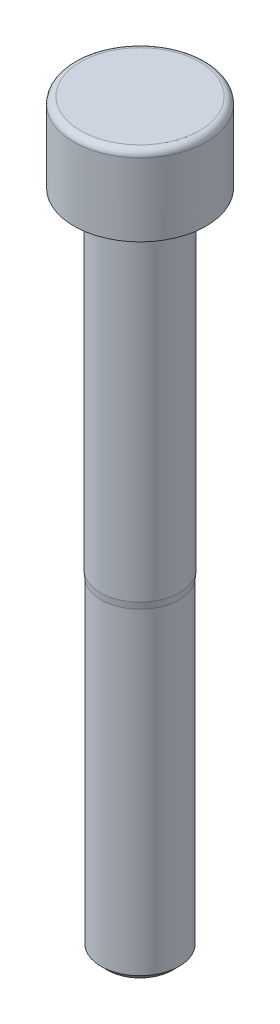
ISO-10303-21;
HEADER;
FILE_DESCRIPTION(('STEP AP214'),'2;1');
FILE_NAME('part.step','',(''),(''),'','','');
FILE_SCHEMA(('AUTOMOTIVE_DESIGN { 1 0 10303 214 1 1 1 1 }'));
ENDSEC;
DATA;
#1=APPLICATION_CONTEXT('core data for automotive mechanical design processes');
#2=APPLICATION_PROTOCOL_DEFINITION('international standard','automotive_design',2000,#1);
#3=PRODUCT_CONTEXT('',#1,'mechanical');
#4=PRODUCT('Part','Part','',(#3));
#5=PRODUCT_RELATED_PRODUCT_CATEGORY('part','',(#4));
#6=PRODUCT_DEFINITION_FORMATION('','',#4);
#7=PRODUCT_DEFINITION_CONTEXT('part definition',#1,'design');
#8=PRODUCT_DEFINITION('design','',#6,#7);
#9=PRODUCT_DEFINITION_SHAPE('','',#8);
#10=(LENGTH_UNIT() NAMED_UNIT(*) SI_UNIT(.MILLI.,.METRE.));
#11=(NAMED_UNIT(*) PLANE_ANGLE_UNIT() SI_UNIT($,.RADIAN.));
#12=(NAMED_UNIT(*) SI_UNIT($,.STERADIAN.) SOLID_ANGLE_UNIT());
#13=UNCERTAINTY_MEASURE_WITH_UNIT(LENGTH_MEASURE(1.E-05),#10,'distance_accuracy_value','');
#14=(GEOMETRIC_REPRESENTATION_CONTEXT(3) GLOBAL_UNCERTAINTY_ASSIGNED_CONTEXT((#13)) GLOBAL_UNIT_ASSIGNED_CONTEXT((#10,
#11,#12)) REPRESENTATION_CONTEXT('',''));
#15=CARTESIAN_POINT('',(0.,0.,0.));
#16=DIRECTION('',(0.,0.,1.));
#17=DIRECTION('',(1.,0.,0.));
#18=AXIS2_PLACEMENT_3D('',#15,#16,#17);
#19=CARTESIAN_POINT('',(0.,56.,0.));
#20=DIRECTION('',(0.,1.,0.));
#21=DIRECTION('',(0.,0.,1.));
#22=AXIS2_PLACEMENT_3D('',#19,#20,#21);
#23=PLANE('',#22);
#24=CARTESIAN_POINT('',(0.,56.,0.));
#25=DIRECTION('',(0.,1.,0.));
#26=DIRECTION('',(0.,0.,1.));
#27=AXIS2_PLACEMENT_3D('',#24,#25,#26);
#28=CIRCLE('',#27,4.5);
#29=CARTESIAN_POINT('',(0.,56.,4.5));
#30=VERTEX_POINT('',#29);
#31=EDGE_CURVE('E10',#30,#30,#28,.T.);
#32=ORIENTED_EDGE('',*,*,#31,.T.);
#33=EDGE_LOOP('',(#32));
#34=FACE_BOUND('',#33,.T.);
#35=ADVANCED_FACE('F33',(#34),#23,.T.);
#36=CARTESIAN_POINT('',(0.,0.,0.));
#37=DIRECTION('',(0.,-1.,0.));
#38=DIRECTION('',(0.,0.,-1.));
#39=AXIS2_PLACEMENT_3D('',#36,#37,#38);
#40=CYLINDRICAL_SURFACE('',#39,5.);
#41=CARTESIAN_POINT('',(0.,55.5,0.));
#42=DIRECTION('',(0.,1.,0.));
#43=DIRECTION('',(0.,0.,1.));
#44=AXIS2_PLACEMENT_3D('',#41,#42,#43);
#45=CIRCLE('',#44,5.);
#46=CARTESIAN_POINT('',(0.,55.5,5.));
#47=VERTEX_POINT('',#46);
#48=EDGE_CURVE('E40',#47,#47,#45,.F.);
#49=ORIENTED_EDGE('',*,*,#48,.T.);
#50=EDGE_LOOP('',(#49));
#51=FACE_BOUND('',#50,.T.);
#52=CARTESIAN_POINT('',(0.,50.,0.));
#53=DIRECTION('',(0.,-1.,0.));
#54=DIRECTION('',(0.,0.,-1.));
#55=AXIS2_PLACEMENT_3D('',#52,#53,#54);
#56=CIRCLE('',#55,5.);
#57=CARTESIAN_POINT('',(0.,50.,-5.));
#58=VERTEX_POINT('',#57);
#59=EDGE_CURVE('E53',#58,#58,#56,.T.);
#60=ORIENTED_EDGE('',*,*,#59,.F.);
#61=EDGE_LOOP('',(#60));
#62=FACE_BOUND('',#61,.T.);
#63=ADVANCED_FACE('F85',(#51,#62),#40,.T.);
#64=CARTESIAN_POINT('',(5.,50.,0.));
#65=DIRECTION('',(0.,-1.,0.));
#66=DIRECTION('',(0.,0.,-1.));
#67=AXIS2_PLACEMENT_3D('',#64,#65,#66);
#68=PLANE('',#67);
#69=ORIENTED_EDGE('',*,*,#59,.T.);
#70=EDGE_LOOP('',(#69));
#71=FACE_BOUND('',#70,.T.);
#72=CARTESIAN_POINT('',(0.,50.,0.));
#73=DIRECTION('',(0.,-1.,0.));
#74=DIRECTION('',(0.,0.,-1.));
#75=AXIS2_PLACEMENT_3D('',#72,#73,#74);
#76=CIRCLE('',#75,3.);
#77=CARTESIAN_POINT('',(0.,50.,-3.));
#78=VERTEX_POINT('',#77);
#79=EDGE_CURVE('E56',#78,#78,#76,.T.);
#80=ORIENTED_EDGE('',*,*,#79,.F.);
#81=EDGE_LOOP('',(#80));
#82=FACE_BOUND('',#81,.T.);
#83=ADVANCED_FACE('F81',(#71,#82),#68,.T.);
#84=CARTESIAN_POINT('',(0.,0.,0.));
#85=DIRECTION('',(0.,-1.,0.));
#86=DIRECTION('',(0.,0.,-1.));
#87=AXIS2_PLACEMENT_3D('',#84,#85,#86);
#88=CYLINDRICAL_SURFACE('',#87,3.);
#89=ORIENTED_EDGE('',*,*,#79,.T.);
#90=EDGE_LOOP('',(#89));
#91=FACE_BOUND('',#90,.T.);
#92=CARTESIAN_POINT('',(0.,25.,0.));
#93=DIRECTION('',(0.,-1.,0.));
#94=DIRECTION('',(0.,0.,-1.));
#95=AXIS2_PLACEMENT_3D('',#92,#93,#94);
#96=CIRCLE('',#95,3.);
#97=CARTESIAN_POINT('',(0.,25.,-3.));
#98=VERTEX_POINT('',#97);
#99=EDGE_CURVE('E59',#98,#98,#96,.T.);
#100=ORIENTED_EDGE('',*,*,#99,.F.);
#101=EDGE_LOOP('',(#100));
#102=FACE_BOUND('',#101,.T.);
#103=ADVANCED_FACE('F70',(#91,#102),#88,.T.);
#104=CARTESIAN_POINT('',(0.,24.5,0.));
#105=DIRECTION('',(0.,1.,0.));
#106=DIRECTION('',(0.,0.,1.));
#107=AXIS2_PLACEMENT_3D('',#104,#105,#106);
#108=CONICAL_SURFACE('',#107,2.95,0.0996686524911665);
#109=ORIENTED_EDGE('',*,*,#99,.T.);
#110=EDGE_LOOP('',(#109));
#111=FACE_BOUND('',#110,.T.);
#112=CARTESIAN_POINT('',(0.,24.5,0.));
#113=DIRECTION('',(0.,-1.,0.));
#114=DIRECTION('',(0.,0.,-1.));
#115=AXIS2_PLACEMENT_3D('',#112,#113,#114);
#116=CIRCLE('',#115,2.95);
#117=CARTESIAN_POINT('',(0.,24.5,-2.95));
#118=VERTEX_POINT('',#117);
#119=EDGE_CURVE('E62',#118,#118,#116,.T.);
#120=ORIENTED_EDGE('',*,*,#119,.F.);
#121=EDGE_LOOP('',(#120));
#122=FACE_BOUND('',#121,.T.);
#123=ADVANCED_FACE('F68',(#111,#122),#108,.T.);
#124=CARTESIAN_POINT('',(0.,0.,0.));
#125=DIRECTION('',(0.,-1.,0.));
#126=DIRECTION('',(0.,0.,-1.));
#127=AXIS2_PLACEMENT_3D('',#124,#125,#126);
#128=CYLINDRICAL_SURFACE('',#127,2.95);
#129=CARTESIAN_POINT('',(0.,0.500000000000002,0.));
#130=DIRECTION('',(0.,-1.,0.));
#131=DIRECTION('',(0.,0.,-1.));
#132=AXIS2_PLACEMENT_3D('',#129,#130,#131);
#133=CIRCLE('',#132,2.95);
#134=CARTESIAN_POINT('',(0.,0.500000000000002,-2.95));
#135=VERTEX_POINT('',#134);
#136=EDGE_CURVE('E44',#135,#135,#133,.F.);
#137=ORIENTED_EDGE('',*,*,#136,.T.);
#138=EDGE_LOOP('',(#137));
#139=FACE_BOUND('',#138,.T.);
#140=ORIENTED_EDGE('',*,*,#119,.T.);
#141=EDGE_LOOP('',(#140));
#142=FACE_BOUND('',#141,.T.);
#143=ADVANCED_FACE('F66',(#139,#142),#128,.T.);
#144=CARTESIAN_POINT('',(2.95,0.,0.));
#145=DIRECTION('',(0.,-1.,0.));
#146=DIRECTION('',(0.,0.,-1.));
#147=AXIS2_PLACEMENT_3D('',#144,#145,#146);
#148=PLANE('',#147);
#149=CARTESIAN_POINT('',(0.,0.,0.));
#150=DIRECTION('',(0.,-1.,0.));
#151=DIRECTION('',(0.,0.,-1.));
#152=AXIS2_PLACEMENT_3D('',#149,#150,#151);
#153=CIRCLE('',#152,2.45000000000001);
#154=CARTESIAN_POINT('',(0.,0.,-2.45000000000001));
#155=VERTEX_POINT('',#154);
#156=EDGE_CURVE('E48',#155,#155,#153,.T.);
#157=ORIENTED_EDGE('',*,*,#156,.T.);
#158=EDGE_LOOP('',(#157));
#159=FACE_BOUND('',#158,.T.);
#160=ADVANCED_FACE('F78',(#159),#148,.T.);
#161=CARTESIAN_POINT('',(0.,0.,0.));
#162=DIRECTION('',(0.,1.,0.));
#163=DIRECTION('',(0.,0.,1.));
#164=AXIS2_PLACEMENT_3D('',#161,#162,#163);
#165=CONICAL_SURFACE('',#164,2.45000000000001,0.785398163397438);
#166=ORIENTED_EDGE('',*,*,#136,.F.);
#167=EDGE_LOOP('',(#166));
#168=FACE_BOUND('',#167,.T.);
#169=ORIENTED_EDGE('',*,*,#156,.F.);
#170=EDGE_LOOP('',(#169));
#171=FACE_BOUND('',#170,.T.);
#172=ADVANCED_FACE('F94',(#168,#171),#165,.T.);
#173=CARTESIAN_POINT('',(0.,55.5,0.));
#174=DIRECTION('',(0.,1.,0.));
#175=DIRECTION('',(0.,0.,1.));
#176=AXIS2_PLACEMENT_3D('',#173,#174,#175);
#177=TOROIDAL_SURFACE('',#176,4.5,0.5);
#178=ORIENTED_EDGE('',*,*,#31,.F.);
#179=EDGE_LOOP('',(#178));
#180=FACE_BOUND('',#179,.T.);
#181=ORIENTED_EDGE('',*,*,#48,.F.);
#182=EDGE_LOOP('',(#181));
#183=FACE_BOUND('',#182,.T.);
#184=ADVANCED_FACE('F35',(#180,#183),#177,.T.);
#185=CLOSED_SHELL('',(#35,#63,#83,#103,#123,#143,#160,#172,#184));
#186=MANIFOLD_SOLID_BREP('B2',#185);
#187=ADVANCED_BREP_SHAPE_REPRESENTATION('',(#18,#186),#14);
#188=SHAPE_DEFINITION_REPRESENTATION(#9,#187);
ENDSEC;
END-ISO-10303-21;
